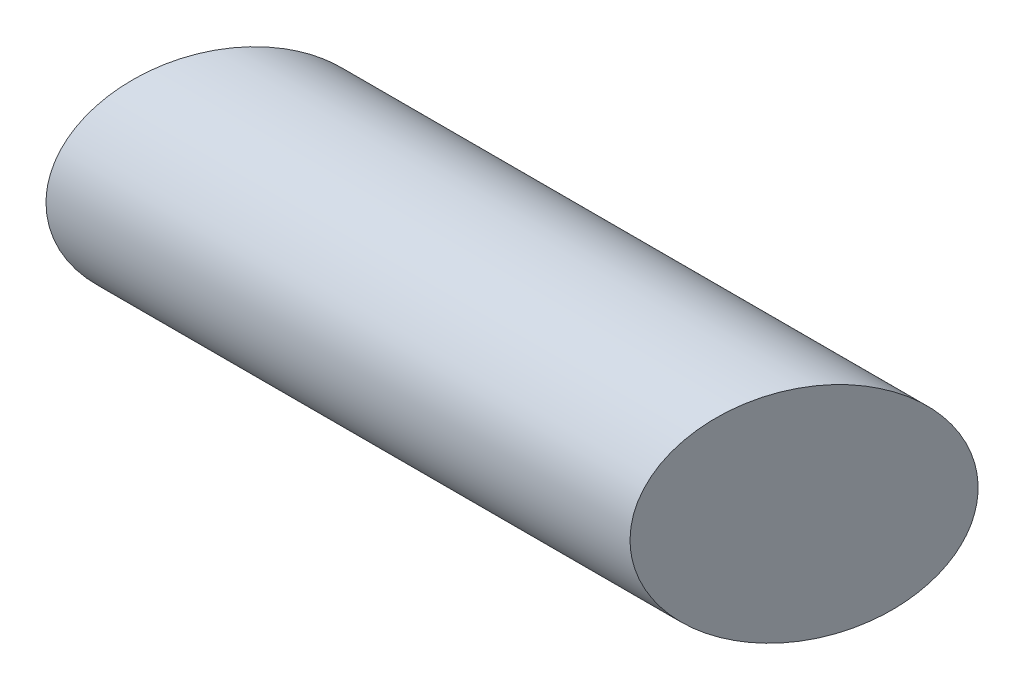
ISO-10303-21;
HEADER;
FILE_DESCRIPTION(('STEP AP214'),'2;1');
FILE_NAME('part.step','',(''),(''),'','','');
FILE_SCHEMA(('AUTOMOTIVE_DESIGN { 1 0 10303 214 1 1 1 1 }'));
ENDSEC;
DATA;
#1=APPLICATION_CONTEXT('core data for automotive mechanical design processes');
#2=APPLICATION_PROTOCOL_DEFINITION('international standard','automotive_design',2000,#1);
#3=PRODUCT_CONTEXT('',#1,'mechanical');
#4=PRODUCT('Part','Part','',(#3));
#5=PRODUCT_RELATED_PRODUCT_CATEGORY('part','',(#4));
#6=PRODUCT_DEFINITION_FORMATION('','',#4);
#7=PRODUCT_DEFINITION_CONTEXT('part definition',#1,'design');
#8=PRODUCT_DEFINITION('design','',#6,#7);
#9=PRODUCT_DEFINITION_SHAPE('','',#8);
#10=(LENGTH_UNIT() NAMED_UNIT(*) SI_UNIT(.MILLI.,.METRE.));
#11=(NAMED_UNIT(*) PLANE_ANGLE_UNIT() SI_UNIT($,.RADIAN.));
#12=(NAMED_UNIT(*) SI_UNIT($,.STERADIAN.) SOLID_ANGLE_UNIT());
#13=UNCERTAINTY_MEASURE_WITH_UNIT(LENGTH_MEASURE(1.E-05),#10,'distance_accuracy_value','');
#14=(GEOMETRIC_REPRESENTATION_CONTEXT(3) GLOBAL_UNCERTAINTY_ASSIGNED_CONTEXT((#13)) GLOBAL_UNIT_ASSIGNED_CONTEXT((#10,
#11,#12)) REPRESENTATION_CONTEXT('',''));
#15=CARTESIAN_POINT('',(0.,0.,0.));
#16=DIRECTION('',(0.,0.,1.));
#17=DIRECTION('',(1.,0.,0.));
#18=AXIS2_PLACEMENT_3D('',#15,#16,#17);
#19=CARTESIAN_POINT('',(51.308,0.,0.));
#20=DIRECTION('',(-1.,0.,0.));
#21=DIRECTION('',(0.,0.,1.));
#22=AXIS2_PLACEMENT_3D('',#19,#20,#21);
#23=CYLINDRICAL_SURFACE('',#22,6.35);
#24=CARTESIAN_POINT('',(3.66617420935413,0.,0.));
#25=DIRECTION('',(0.86602540378444,0.,0.499999999999998));
#26=DIRECTION('',(-0.499999999999998,0.,0.86602540378444));
#27=AXIS2_PLACEMENT_3D('',#24,#25,#26);
#28=ELLIPSE('',#27,7.33234841870824,6.35);
#29=CARTESIAN_POINT('',(0.,0.,6.35));
#30=VERTEX_POINT('',#29);
#31=EDGE_CURVE('E36',#30,#30,#28,.T.);
#32=ORIENTED_EDGE('',*,*,#31,.T.);
#33=EDGE_LOOP('',(#32));
#34=FACE_BOUND('',#33,.T.);
#35=CARTESIAN_POINT('',(37.5210292023743,0.,0.));
#36=DIRECTION('',(-0.862710591847333,0.,-0.505697967876503));
#37=DIRECTION('',(-0.505697967876503,0.,0.862710591847333));
#38=AXIS2_PLACEMENT_3D('',#35,#36,#37);
#39=ELLIPSE('',#38,7.36052166277762,6.35);
#40=CARTESIAN_POINT('',(33.7988283549967,0.,6.35));
#41=VERTEX_POINT('',#40);
#42=EDGE_CURVE('E10',#41,#41,#39,.T.);
#43=ORIENTED_EDGE('',*,*,#42,.T.);
#44=EDGE_LOOP('',(#43));
#45=FACE_BOUND('',#44,.T.);
#46=ADVANCED_FACE('F30',(#34,#45),#23,.T.);
#47=CARTESIAN_POINT('',(0.,-6.35,6.35));
#48=DIRECTION('',(0.86602540378444,0.,0.499999999999998));
#49=DIRECTION('',(0.499999999999998,0.,-0.86602540378444));
#50=AXIS2_PLACEMENT_3D('',#47,#48,#49);
#51=PLANE('',#50);
#52=ORIENTED_EDGE('',*,*,#31,.F.);
#53=EDGE_LOOP('',(#52));
#54=FACE_BOUND('',#53,.T.);
#55=ADVANCED_FACE('F43',(#54),#51,.F.);
#56=CARTESIAN_POINT('',(33.7988283549967,-6.35,6.35));
#57=DIRECTION('',(-0.862710591847333,0.,-0.505697967876503));
#58=DIRECTION('',(-0.505697967876503,0.,0.862710591847333));
#59=AXIS2_PLACEMENT_3D('',#56,#57,#58);
#60=PLANE('',#59);
#61=ORIENTED_EDGE('',*,*,#42,.F.);
#62=EDGE_LOOP('',(#61));
#63=FACE_BOUND('',#62,.T.);
#64=ADVANCED_FACE('F45',(#63),#60,.F.);
#65=CLOSED_SHELL('',(#46,#55,#64));
#66=MANIFOLD_SOLID_BREP('B2',#65);
#67=ADVANCED_BREP_SHAPE_REPRESENTATION('',(#18,#66),#14);
#68=SHAPE_DEFINITION_REPRESENTATION(#9,#67);
ENDSEC;
END-ISO-10303-21;
